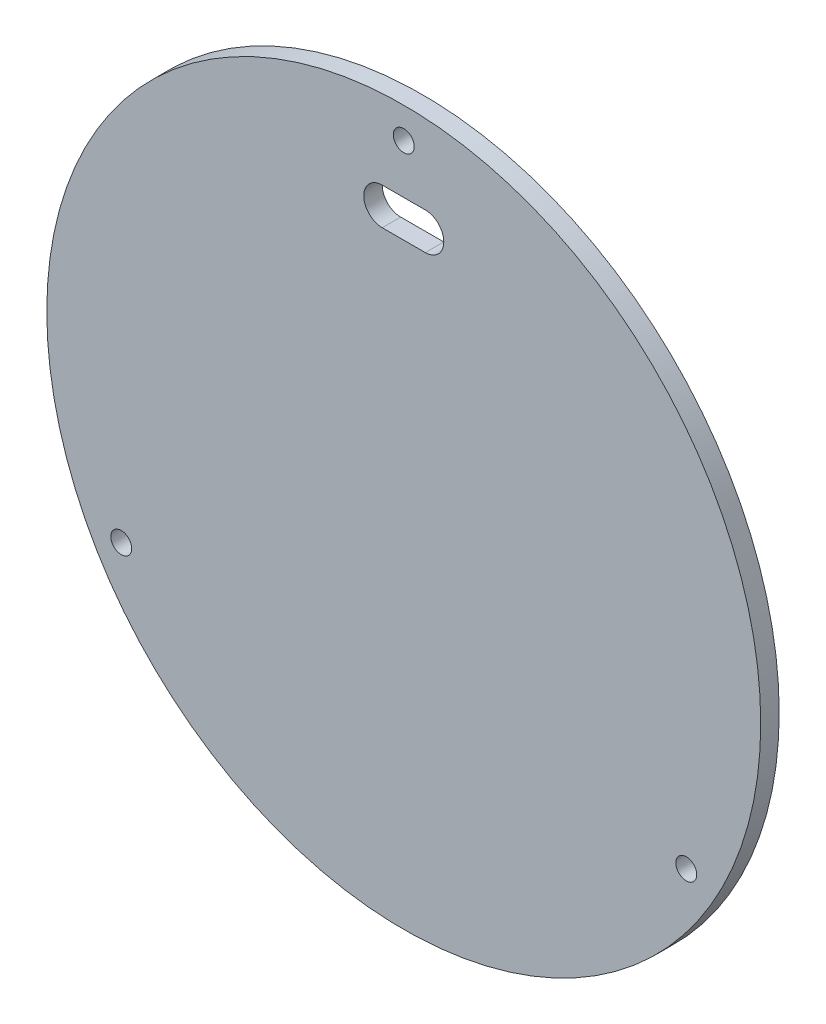
ISO-10303-21;
HEADER;
FILE_DESCRIPTION(('STEP AP214'),'2;1');
FILE_NAME('part.step','',(''),(''),'','','');
FILE_SCHEMA(('AUTOMOTIVE_DESIGN { 1 0 10303 214 1 1 1 1 }'));
ENDSEC;
DATA;
#1=APPLICATION_CONTEXT('core data for automotive mechanical design processes');
#2=APPLICATION_PROTOCOL_DEFINITION('international standard','automotive_design',2000,#1);
#3=PRODUCT_CONTEXT('',#1,'mechanical');
#4=PRODUCT('Part','Part','',(#3));
#5=PRODUCT_RELATED_PRODUCT_CATEGORY('part','',(#4));
#6=PRODUCT_DEFINITION_FORMATION('','',#4);
#7=PRODUCT_DEFINITION_CONTEXT('part definition',#1,'design');
#8=PRODUCT_DEFINITION('design','',#6,#7);
#9=PRODUCT_DEFINITION_SHAPE('','',#8);
#10=(LENGTH_UNIT() NAMED_UNIT(*) SI_UNIT(.MILLI.,.METRE.));
#11=(NAMED_UNIT(*) PLANE_ANGLE_UNIT() SI_UNIT($,.RADIAN.));
#12=(NAMED_UNIT(*) SI_UNIT($,.STERADIAN.) SOLID_ANGLE_UNIT());
#13=UNCERTAINTY_MEASURE_WITH_UNIT(LENGTH_MEASURE(1.E-05),#10,'distance_accuracy_value','');
#14=(GEOMETRIC_REPRESENTATION_CONTEXT(3) GLOBAL_UNCERTAINTY_ASSIGNED_CONTEXT((#13)) GLOBAL_UNIT_ASSIGNED_CONTEXT((#10,
#11,#12)) REPRESENTATION_CONTEXT('',''));
#15=CARTESIAN_POINT('',(0.,0.,0.));
#16=DIRECTION('',(0.,0.,1.));
#17=DIRECTION('',(1.,0.,0.));
#18=AXIS2_PLACEMENT_3D('',#15,#16,#17);
#19=CARTESIAN_POINT('',(0.,0.,3.));
#20=DIRECTION('',(0.,0.,1.));
#21=DIRECTION('',(1.,0.,0.));
#22=AXIS2_PLACEMENT_3D('',#19,#20,#21);
#23=PLANE('',#22);
#24=CARTESIAN_POINT('',(-3.5,42.,3.));
#25=DIRECTION('',(0.,0.,1.));
#26=DIRECTION('',(1.,0.,0.));
#27=AXIS2_PLACEMENT_3D('',#24,#25,#26);
#28=CIRCLE('',#27,3.);
#29=CARTESIAN_POINT('',(-3.5,45.,3.));
#30=VERTEX_POINT('',#29);
#31=CARTESIAN_POINT('',(-3.5,39.,3.));
#32=VERTEX_POINT('',#31);
#33=EDGE_CURVE('E58',#30,#32,#28,.T.);
#34=ORIENTED_EDGE('',*,*,#33,.F.);
#35=DIRECTION('',(1.,0.,0.));
#36=VECTOR('',#35,1.);
#37=CARTESIAN_POINT('',(-3.5,45.,3.));
#38=LINE('',#37,#36);
#39=CARTESIAN_POINT('',(3.5,45.,3.));
#40=VERTEX_POINT('',#39);
#41=EDGE_CURVE('E105',#30,#40,#38,.T.);
#42=ORIENTED_EDGE('',*,*,#41,.T.);
#43=CARTESIAN_POINT('',(3.5,42.,3.));
#44=DIRECTION('',(0.,0.,1.));
#45=DIRECTION('',(1.,0.,0.));
#46=AXIS2_PLACEMENT_3D('',#43,#44,#45);
#47=CIRCLE('',#46,3.);
#48=CARTESIAN_POINT('',(3.5,39.,3.));
#49=VERTEX_POINT('',#48);
#50=EDGE_CURVE('E110',#49,#40,#47,.T.);
#51=ORIENTED_EDGE('',*,*,#50,.F.);
#52=DIRECTION('',(1.,0.,0.));
#53=VECTOR('',#52,1.);
#54=CARTESIAN_POINT('',(-3.5,39.,3.));
#55=LINE('',#54,#53);
#56=EDGE_CURVE('E119',#32,#49,#55,.T.);
#57=ORIENTED_EDGE('',*,*,#56,.F.);
#58=EDGE_LOOP('',(#34,#42,#51,#57));
#59=FACE_BOUND('',#58,.T.);
#60=CARTESIAN_POINT('',(45.8993464005775,-26.4999999999987,3.));
#61=DIRECTION('',(0.,0.,1.));
#62=DIRECTION('',(1.,0.,0.));
#63=AXIS2_PLACEMENT_3D('',#60,#61,#62);
#64=CIRCLE('',#63,1.70000000000203);
#65=CARTESIAN_POINT('',(47.5993464005795,-26.4999999999987,3.));
#66=VERTEX_POINT('',#65);
#67=EDGE_CURVE('E142',#66,#66,#64,.T.);
#68=ORIENTED_EDGE('',*,*,#67,.F.);
#69=EDGE_LOOP('',(#68));
#70=FACE_BOUND('',#69,.T.);
#71=CARTESIAN_POINT('',(0.,0.,3.));
#72=DIRECTION('',(0.,0.,1.));
#73=DIRECTION('',(1.,0.,0.));
#74=AXIS2_PLACEMENT_3D('',#71,#72,#73);
#75=CIRCLE('',#74,58.);
#76=CARTESIAN_POINT('',(58.,0.,3.));
#77=VERTEX_POINT('',#76);
#78=EDGE_CURVE('E11',#77,#77,#75,.T.);
#79=ORIENTED_EDGE('',*,*,#78,.T.);
#80=EDGE_LOOP('',(#79));
#81=FACE_BOUND('',#80,.T.);
#82=CARTESIAN_POINT('',(0.,53.,3.));
#83=DIRECTION('',(0.,0.,1.));
#84=DIRECTION('',(1.,0.,0.));
#85=AXIS2_PLACEMENT_3D('',#82,#83,#84);
#86=CIRCLE('',#85,1.7);
#87=CARTESIAN_POINT('',(1.7,53.,3.));
#88=VERTEX_POINT('',#87);
#89=EDGE_CURVE('E150',#88,#88,#86,.T.);
#90=ORIENTED_EDGE('',*,*,#89,.F.);
#91=EDGE_LOOP('',(#90));
#92=FACE_BOUND('',#91,.T.);
#93=CARTESIAN_POINT('',(-45.899346400573,-26.5000000000013,3.));
#94=DIRECTION('',(0.,0.,1.));
#95=DIRECTION('',(1.,0.,0.));
#96=AXIS2_PLACEMENT_3D('',#93,#94,#95);
#97=CIRCLE('',#96,1.70000000000301);
#98=CARTESIAN_POINT('',(-44.19934640057,-26.5000000000013,3.));
#99=VERTEX_POINT('',#98);
#100=EDGE_CURVE('E134',#99,#99,#97,.T.);
#101=ORIENTED_EDGE('',*,*,#100,.F.);
#102=EDGE_LOOP('',(#101));
#103=FACE_BOUND('',#102,.T.);
#104=ADVANCED_FACE('F42',(#59,#70,#81,#92,#103),#23,.T.);
#105=CARTESIAN_POINT('',(0.,0.,0.));
#106=DIRECTION('',(0.,0.,1.));
#107=DIRECTION('',(1.,0.,0.));
#108=AXIS2_PLACEMENT_3D('',#105,#106,#107);
#109=PLANE('',#108);
#110=DIRECTION('',(1.,0.,0.));
#111=VECTOR('',#110,1.);
#112=CARTESIAN_POINT('',(-3.5,45.,0.));
#113=LINE('',#112,#111);
#114=CARTESIAN_POINT('',(-3.5,45.,0.));
#115=VERTEX_POINT('',#114);
#116=CARTESIAN_POINT('',(3.5,45.,0.));
#117=VERTEX_POINT('',#116);
#118=EDGE_CURVE('E94',#115,#117,#113,.T.);
#119=ORIENTED_EDGE('',*,*,#118,.F.);
#120=CARTESIAN_POINT('',(-3.5,42.,0.));
#121=DIRECTION('',(0.,0.,1.));
#122=DIRECTION('',(1.,0.,0.));
#123=AXIS2_PLACEMENT_3D('',#120,#121,#122);
#124=CIRCLE('',#123,3.);
#125=CARTESIAN_POINT('',(-3.5,39.,0.));
#126=VERTEX_POINT('',#125);
#127=EDGE_CURVE('E87',#115,#126,#124,.T.);
#128=ORIENTED_EDGE('',*,*,#127,.T.);
#129=DIRECTION('',(1.,0.,0.));
#130=VECTOR('',#129,1.);
#131=CARTESIAN_POINT('',(-3.5,39.,0.));
#132=LINE('',#131,#130);
#133=CARTESIAN_POINT('',(3.5,39.,0.));
#134=VERTEX_POINT('',#133);
#135=EDGE_CURVE('E97',#126,#134,#132,.T.);
#136=ORIENTED_EDGE('',*,*,#135,.T.);
#137=CARTESIAN_POINT('',(3.5,42.,0.));
#138=DIRECTION('',(0.,0.,1.));
#139=DIRECTION('',(1.,0.,0.));
#140=AXIS2_PLACEMENT_3D('',#137,#138,#139);
#141=CIRCLE('',#140,3.);
#142=EDGE_CURVE('E66',#134,#117,#141,.T.);
#143=ORIENTED_EDGE('',*,*,#142,.T.);
#144=EDGE_LOOP('',(#119,#128,#136,#143));
#145=FACE_BOUND('',#144,.T.);
#146=CARTESIAN_POINT('',(0.,0.,0.));
#147=DIRECTION('',(0.,0.,1.));
#148=DIRECTION('',(1.,0.,0.));
#149=AXIS2_PLACEMENT_3D('',#146,#147,#148);
#150=CIRCLE('',#149,58.);
#151=CARTESIAN_POINT('',(58.,0.,0.));
#152=VERTEX_POINT('',#151);
#153=EDGE_CURVE('E46',#152,#152,#150,.T.);
#154=ORIENTED_EDGE('',*,*,#153,.F.);
#155=EDGE_LOOP('',(#154));
#156=FACE_BOUND('',#155,.T.);
#157=CARTESIAN_POINT('',(0.,53.,0.));
#158=DIRECTION('',(0.,0.,1.));
#159=DIRECTION('',(1.,0.,0.));
#160=AXIS2_PLACEMENT_3D('',#157,#158,#159);
#161=CIRCLE('',#160,1.7);
#162=CARTESIAN_POINT('',(1.7,53.,0.));
#163=VERTEX_POINT('',#162);
#164=EDGE_CURVE('E146',#163,#163,#161,.T.);
#165=ORIENTED_EDGE('',*,*,#164,.T.);
#166=EDGE_LOOP('',(#165));
#167=FACE_BOUND('',#166,.T.);
#168=CARTESIAN_POINT('',(45.8993464005775,-26.4999999999987,0.));
#169=DIRECTION('',(0.,0.,1.));
#170=DIRECTION('',(1.,0.,0.));
#171=AXIS2_PLACEMENT_3D('',#168,#169,#170);
#172=CIRCLE('',#171,1.70000000000203);
#173=CARTESIAN_POINT('',(47.5993464005795,-26.4999999999987,0.));
#174=VERTEX_POINT('',#173);
#175=EDGE_CURVE('E138',#174,#174,#172,.T.);
#176=ORIENTED_EDGE('',*,*,#175,.T.);
#177=EDGE_LOOP('',(#176));
#178=FACE_BOUND('',#177,.T.);
#179=CARTESIAN_POINT('',(-45.899346400573,-26.5000000000013,0.));
#180=DIRECTION('',(0.,0.,1.));
#181=DIRECTION('',(1.,0.,0.));
#182=AXIS2_PLACEMENT_3D('',#179,#180,#181);
#183=CIRCLE('',#182,1.70000000000301);
#184=CARTESIAN_POINT('',(-44.19934640057,-26.5000000000013,0.));
#185=VERTEX_POINT('',#184);
#186=EDGE_CURVE('E128',#185,#185,#183,.T.);
#187=ORIENTED_EDGE('',*,*,#186,.T.);
#188=EDGE_LOOP('',(#187));
#189=FACE_BOUND('',#188,.T.);
#190=ADVANCED_FACE('F102',(#145,#156,#167,#178,#189),#109,.F.);
#191=CARTESIAN_POINT('',(0.,0.,3.));
#192=DIRECTION('',(0.,0.,-1.));
#193=DIRECTION('',(-1.,0.,0.));
#194=AXIS2_PLACEMENT_3D('',#191,#192,#193);
#195=CYLINDRICAL_SURFACE('',#194,58.);
#196=ORIENTED_EDGE('',*,*,#78,.F.);
#197=EDGE_LOOP('',(#196));
#198=FACE_BOUND('',#197,.T.);
#199=ORIENTED_EDGE('',*,*,#153,.T.);
#200=EDGE_LOOP('',(#199));
#201=FACE_BOUND('',#200,.T.);
#202=ADVANCED_FACE('F44',(#198,#201),#195,.T.);
#203=CARTESIAN_POINT('',(0.,53.,3.));
#204=DIRECTION('',(0.,0.,-1.));
#205=DIRECTION('',(-1.,0.,0.));
#206=AXIS2_PLACEMENT_3D('',#203,#204,#205);
#207=CYLINDRICAL_SURFACE('',#206,1.7);
#208=ORIENTED_EDGE('',*,*,#89,.T.);
#209=EDGE_LOOP('',(#208));
#210=FACE_BOUND('',#209,.T.);
#211=ORIENTED_EDGE('',*,*,#164,.F.);
#212=EDGE_LOOP('',(#211));
#213=FACE_BOUND('',#212,.T.);
#214=ADVANCED_FACE('F161',(#210,#213),#207,.F.);
#215=CARTESIAN_POINT('',(45.8993464005775,-26.4999999999987,3.));
#216=DIRECTION('',(0.,0.,-1.));
#217=DIRECTION('',(-1.,0.,0.));
#218=AXIS2_PLACEMENT_3D('',#215,#216,#217);
#219=CYLINDRICAL_SURFACE('',#218,1.70000000000203);
#220=ORIENTED_EDGE('',*,*,#67,.T.);
#221=EDGE_LOOP('',(#220));
#222=FACE_BOUND('',#221,.T.);
#223=ORIENTED_EDGE('',*,*,#175,.F.);
#224=EDGE_LOOP('',(#223));
#225=FACE_BOUND('',#224,.T.);
#226=ADVANCED_FACE('F163',(#222,#225),#219,.F.);
#227=CARTESIAN_POINT('',(-45.899346400573,-26.5000000000013,3.));
#228=DIRECTION('',(0.,0.,-1.));
#229=DIRECTION('',(-1.,0.,0.));
#230=AXIS2_PLACEMENT_3D('',#227,#228,#229);
#231=CYLINDRICAL_SURFACE('',#230,1.70000000000301);
#232=ORIENTED_EDGE('',*,*,#100,.T.);
#233=EDGE_LOOP('',(#232));
#234=FACE_BOUND('',#233,.T.);
#235=ORIENTED_EDGE('',*,*,#186,.F.);
#236=EDGE_LOOP('',(#235));
#237=FACE_BOUND('',#236,.T.);
#238=ADVANCED_FACE('F170',(#234,#237),#231,.F.);
#239=CARTESIAN_POINT('',(-3.5,42.,0.));
#240=DIRECTION('',(0.,0.,1.));
#241=DIRECTION('',(1.,0.,0.));
#242=AXIS2_PLACEMENT_3D('',#239,#240,#241);
#243=CYLINDRICAL_SURFACE('',#242,3.);
#244=ORIENTED_EDGE('',*,*,#33,.T.);
#245=DIRECTION('',(0.,0.,1.));
#246=VECTOR('',#245,1.);
#247=CARTESIAN_POINT('',(-3.5,39.,0.));
#248=LINE('',#247,#246);
#249=EDGE_CURVE('E83',#126,#32,#248,.T.);
#250=ORIENTED_EDGE('',*,*,#249,.F.);
#251=ORIENTED_EDGE('',*,*,#127,.F.);
#252=DIRECTION('',(0.,0.,1.));
#253=VECTOR('',#252,1.);
#254=CARTESIAN_POINT('',(-3.5,45.,0.));
#255=LINE('',#254,#253);
#256=EDGE_CURVE('E125',#115,#30,#255,.T.);
#257=ORIENTED_EDGE('',*,*,#256,.T.);
#258=EDGE_LOOP('',(#244,#250,#251,#257));
#259=FACE_BOUND('',#258,.T.);
#260=ADVANCED_FACE('F85',(#259),#243,.F.);
#261=CARTESIAN_POINT('',(-3.5,45.,0.));
#262=DIRECTION('',(0.,-1.,0.));
#263=DIRECTION('',(0.,0.,-1.));
#264=AXIS2_PLACEMENT_3D('',#261,#262,#263);
#265=PLANE('',#264);
#266=ORIENTED_EDGE('',*,*,#41,.F.);
#267=ORIENTED_EDGE('',*,*,#256,.F.);
#268=ORIENTED_EDGE('',*,*,#118,.T.);
#269=DIRECTION('',(0.,0.,1.));
#270=VECTOR('',#269,1.);
#271=CARTESIAN_POINT('',(3.5,45.,0.));
#272=LINE('',#271,#270);
#273=EDGE_CURVE('E129',#117,#40,#272,.T.);
#274=ORIENTED_EDGE('',*,*,#273,.T.);
#275=EDGE_LOOP('',(#266,#267,#268,#274));
#276=FACE_BOUND('',#275,.T.);
#277=ADVANCED_FACE('F197',(#276),#265,.T.);
#278=CARTESIAN_POINT('',(3.5,42.,0.));
#279=DIRECTION('',(0.,0.,1.));
#280=DIRECTION('',(1.,0.,0.));
#281=AXIS2_PLACEMENT_3D('',#278,#279,#280);
#282=CYLINDRICAL_SURFACE('',#281,3.);
#283=ORIENTED_EDGE('',*,*,#50,.T.);
#284=ORIENTED_EDGE('',*,*,#273,.F.);
#285=ORIENTED_EDGE('',*,*,#142,.F.);
#286=DIRECTION('',(0.,0.,1.));
#287=VECTOR('',#286,1.);
#288=CARTESIAN_POINT('',(3.5,39.,0.));
#289=LINE('',#288,#287);
#290=EDGE_CURVE('E93',#134,#49,#289,.T.);
#291=ORIENTED_EDGE('',*,*,#290,.T.);
#292=EDGE_LOOP('',(#283,#284,#285,#291));
#293=FACE_BOUND('',#292,.T.);
#294=ADVANCED_FACE('F202',(#293),#282,.F.);
#295=CARTESIAN_POINT('',(-3.5,39.,0.));
#296=DIRECTION('',(0.,-1.,0.));
#297=DIRECTION('',(0.,0.,-1.));
#298=AXIS2_PLACEMENT_3D('',#295,#296,#297);
#299=PLANE('',#298);
#300=ORIENTED_EDGE('',*,*,#56,.T.);
#301=ORIENTED_EDGE('',*,*,#290,.F.);
#302=ORIENTED_EDGE('',*,*,#135,.F.);
#303=ORIENTED_EDGE('',*,*,#249,.T.);
#304=EDGE_LOOP('',(#300,#301,#302,#303));
#305=FACE_BOUND('',#304,.T.);
#306=ADVANCED_FACE('F98',(#305),#299,.F.);
#307=CLOSED_SHELL('',(#104,#190,#202,#214,#226,#238,#260,#277,#294,#306));
#308=MANIFOLD_SOLID_BREP('B2',#307);
#309=ADVANCED_BREP_SHAPE_REPRESENTATION('',(#18,#308),#14);
#310=SHAPE_DEFINITION_REPRESENTATION(#9,#309);
ENDSEC;
END-ISO-10303-21;
